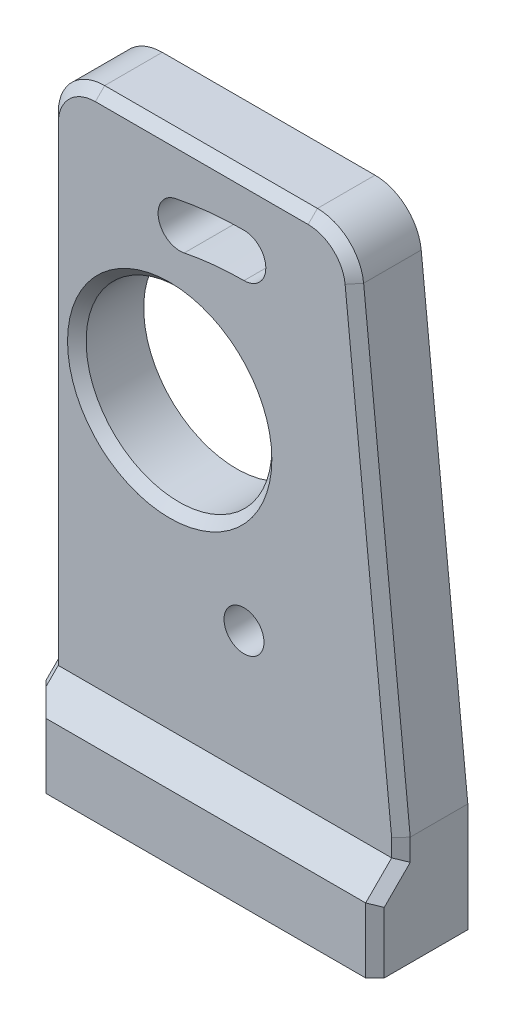
ISO-10303-21;
HEADER;
FILE_DESCRIPTION(('STEP AP214'),'2;1');
FILE_NAME('part.step','',(''),(''),'','','');
FILE_SCHEMA(('AUTOMOTIVE_DESIGN { 1 0 10303 214 1 1 1 1 }'));
ENDSEC;
DATA;
#1=APPLICATION_CONTEXT('core data for automotive mechanical design processes');
#2=APPLICATION_PROTOCOL_DEFINITION('international standard','automotive_design',2000,#1);
#3=PRODUCT_CONTEXT('',#1,'mechanical');
#4=PRODUCT('Part','Part','',(#3));
#5=PRODUCT_RELATED_PRODUCT_CATEGORY('part','',(#4));
#6=PRODUCT_DEFINITION_FORMATION('','',#4);
#7=PRODUCT_DEFINITION_CONTEXT('part definition',#1,'design');
#8=PRODUCT_DEFINITION('design','',#6,#7);
#9=PRODUCT_DEFINITION_SHAPE('','',#8);
#10=(LENGTH_UNIT() NAMED_UNIT(*) SI_UNIT(.MILLI.,.METRE.));
#11=(NAMED_UNIT(*) PLANE_ANGLE_UNIT() SI_UNIT($,.RADIAN.));
#12=(NAMED_UNIT(*) SI_UNIT($,.STERADIAN.) SOLID_ANGLE_UNIT());
#13=UNCERTAINTY_MEASURE_WITH_UNIT(LENGTH_MEASURE(1.E-05),#10,'distance_accuracy_value','');
#14=(GEOMETRIC_REPRESENTATION_CONTEXT(3) GLOBAL_UNCERTAINTY_ASSIGNED_CONTEXT((#13)) GLOBAL_UNIT_ASSIGNED_CONTEXT((#10,
#11,#12)) REPRESENTATION_CONTEXT('',''));
#15=CARTESIAN_POINT('',(0.,0.,0.));
#16=DIRECTION('',(0.,0.,1.));
#17=DIRECTION('',(1.,0.,0.));
#18=AXIS2_PLACEMENT_3D('',#15,#16,#17);
#19=CARTESIAN_POINT('',(7.91121884413889,23.0319457170168,0.));
#20=DIRECTION('',(0.,0.,1.));
#21=DIRECTION('',(1.,0.,0.));
#22=AXIS2_PLACEMENT_3D('',#19,#20,#21);
#23=CYLINDRICAL_SURFACE('',#22,2.15);
#24=CARTESIAN_POINT('',(7.91121884413889,23.0319457170168,4.00000000000001));
#25=DIRECTION('',(0.,0.,-1.));
#26=DIRECTION('',(-1.,0.,0.));
#27=AXIS2_PLACEMENT_3D('',#24,#25,#26);
#28=CIRCLE('',#27,2.15);
#29=CARTESIAN_POINT('',(5.76121884413889,23.0319457170168,4.00000000000001));
#30=VERTEX_POINT('',#29);
#31=EDGE_CURVE('E11',#30,#30,#28,.T.);
#32=ORIENTED_EDGE('',*,*,#31,.T.);
#33=EDGE_LOOP('',(#32));
#34=FACE_BOUND('',#33,.T.);
#35=CARTESIAN_POINT('',(7.91121884413889,23.0319457170168,7.2));
#36=DIRECTION('',(0.,0.,1.));
#37=DIRECTION('',(1.,0.,0.));
#38=AXIS2_PLACEMENT_3D('',#35,#36,#37);
#39=CIRCLE('',#38,2.15);
#40=CARTESIAN_POINT('',(10.0612188441389,23.0319457170168,7.2));
#41=VERTEX_POINT('',#40);
#42=EDGE_CURVE('E207',#41,#41,#39,.T.);
#43=ORIENTED_EDGE('',*,*,#42,.T.);
#44=EDGE_LOOP('',(#43));
#45=FACE_BOUND('',#44,.T.);
#46=ADVANCED_FACE('F37',(#34,#45),#23,.F.);
#47=CARTESIAN_POINT('',(-13.0887811558611,65.3706180274269,10.));
#48=DIRECTION('',(0.,-1.,0.));
#49=DIRECTION('',(0.,0.,-1.));
#50=AXIS2_PLACEMENT_3D('',#47,#48,#49);
#51=PLANE('',#50);
#52=DIRECTION('',(0.,0.,-1.));
#53=VECTOR('',#52,1.);
#54=CARTESIAN_POINT('',(-8.08878115586112,65.3706180274269,10.));
#55=LINE('',#54,#53);
#56=CARTESIAN_POINT('',(-8.08878115586112,65.3706180274269,0.));
#57=VERTEX_POINT('',#56);
#58=CARTESIAN_POINT('',(-8.08878115586112,65.3706180274269,6.2));
#59=VERTEX_POINT('',#58);
#60=EDGE_CURVE('E272',#57,#59,#55,.F.);
#61=ORIENTED_EDGE('',*,*,#60,.T.);
#62=DIRECTION('',(1.,0.,0.));
#63=VECTOR('',#62,1.);
#64=CARTESIAN_POINT('',(14.8206002828227,65.3706180274269,6.2));
#65=LINE('',#64,#63);
#66=CARTESIAN_POINT('',(14.8206002828227,65.3706180274269,6.2));
#67=VERTEX_POINT('',#66);
#68=EDGE_CURVE('E323',#59,#67,#65,.T.);
#69=ORIENTED_EDGE('',*,*,#68,.T.);
#70=DIRECTION('',(0.,0.,-1.));
#71=VECTOR('',#70,1.);
#72=CARTESIAN_POINT('',(14.8206002828227,65.3706180274269,10.));
#73=LINE('',#72,#71);
#74=CARTESIAN_POINT('',(14.8206002828227,65.3706180274269,0.));
#75=VERTEX_POINT('',#74);
#76=EDGE_CURVE('E270',#67,#75,#73,.T.);
#77=ORIENTED_EDGE('',*,*,#76,.T.);
#78=DIRECTION('',(-1.,0.,0.));
#79=VECTOR('',#78,1.);
#80=CARTESIAN_POINT('',(-13.0887811558611,65.3706180274269,0.));
#81=LINE('',#80,#79);
#82=EDGE_CURVE('E243',#75,#57,#81,.T.);
#83=ORIENTED_EDGE('',*,*,#82,.T.);
#84=EDGE_LOOP('',(#61,#69,#77,#83));
#85=FACE_BOUND('',#84,.T.);
#86=ADVANCED_FACE('F434',(#85),#51,.F.);
#87=CARTESIAN_POINT('',(-13.0887811558611,0.,10.));
#88=DIRECTION('',(1.,0.,0.));
#89=DIRECTION('',(0.,0.,-1.));
#90=AXIS2_PLACEMENT_3D('',#87,#88,#89);
#91=PLANE('',#90);
#92=DIRECTION('',(0.,0.,-1.));
#93=VECTOR('',#92,1.);
#94=CARTESIAN_POINT('',(-13.0887811558611,0.,10.));
#95=LINE('',#94,#93);
#96=CARTESIAN_POINT('',(-13.0887811558611,0.,7.49999999999998));
#97=VERTEX_POINT('',#96);
#98=CARTESIAN_POINT('',(-13.0887811558611,0.,0.));
#99=VERTEX_POINT('',#98);
#100=EDGE_CURVE('E248',#97,#99,#95,.T.);
#101=ORIENTED_EDGE('',*,*,#100,.F.);
#102=DIRECTION('',(0.,1.,0.));
#103=VECTOR('',#102,1.);
#104=CARTESIAN_POINT('',(-13.0887811558611,0.,7.49999999999998));
#105=LINE('',#104,#103);
#106=CARTESIAN_POINT('',(-13.0887811558611,8.08578643762685,7.49999999999998));
#107=VERTEX_POINT('',#106);
#108=EDGE_CURVE('E351',#97,#107,#105,.T.);
#109=ORIENTED_EDGE('',*,*,#108,.T.);
#110=DIRECTION('',(0.,0.707106781186544,-0.707106781186551));
#111=VECTOR('',#110,1.);
#112=CARTESIAN_POINT('',(-13.0887811558611,9.09289321881338,6.49289321881345));
#113=LINE('',#112,#111);
#114=CARTESIAN_POINT('',(-13.0887811558611,9.38578643762682,6.2));
#115=VERTEX_POINT('',#114);
#116=EDGE_CURVE('E315',#107,#115,#113,.T.);
#117=ORIENTED_EDGE('',*,*,#116,.T.);
#118=DIRECTION('',(0.,1.,0.));
#119=VECTOR('',#118,1.);
#120=CARTESIAN_POINT('',(-13.0887811558611,60.3706180274269,6.2));
#121=LINE('',#120,#119);
#122=CARTESIAN_POINT('',(-13.0887811558611,60.3706180274269,6.2));
#123=VERTEX_POINT('',#122);
#124=EDGE_CURVE('E313',#115,#123,#121,.T.);
#125=ORIENTED_EDGE('',*,*,#124,.T.);
#126=DIRECTION('',(0.,0.,-1.));
#127=VECTOR('',#126,1.);
#128=CARTESIAN_POINT('',(-13.0887811558611,60.3706180274269,10.));
#129=LINE('',#128,#127);
#130=CARTESIAN_POINT('',(-13.0887811558611,60.3706180274269,0.));
#131=VERTEX_POINT('',#130);
#132=EDGE_CURVE('E264',#123,#131,#129,.T.);
#133=ORIENTED_EDGE('',*,*,#132,.T.);
#134=DIRECTION('',(0.,-1.,0.));
#135=VECTOR('',#134,1.);
#136=CARTESIAN_POINT('',(-13.0887811558611,0.,0.));
#137=LINE('',#136,#135);
#138=EDGE_CURVE('E252',#131,#99,#137,.T.);
#139=ORIENTED_EDGE('',*,*,#138,.T.);
#140=EDGE_LOOP('',(#101,#109,#117,#125,#133,#139));
#141=FACE_BOUND('',#140,.T.);
#142=ADVANCED_FACE('F373',(#141),#91,.F.);
#143=CARTESIAN_POINT('',(28.2870012815656,0.,10.));
#144=DIRECTION('',(0.,1.,0.));
#145=DIRECTION('',(-1.,0.,0.));
#146=AXIS2_PLACEMENT_3D('',#143,#144,#145);
#147=PLANE('',#146);
#148=CARTESIAN_POINT('',(6.18,0.,5.));
#149=DIRECTION('',(0.,-1.,0.));
#150=DIRECTION('',(1.,0.,0.));
#151=AXIS2_PLACEMENT_3D('',#148,#149,#150);
#152=CIRCLE('',#151,1.5);
#153=CARTESIAN_POINT('',(7.68,0.,5.));
#154=VERTEX_POINT('',#153);
#155=EDGE_CURVE('E232',#154,#154,#152,.T.);
#156=ORIENTED_EDGE('',*,*,#155,.F.);
#157=EDGE_LOOP('',(#156));
#158=FACE_BOUND('',#157,.T.);
#159=CARTESIAN_POINT('',(19.36,0.,5.));
#160=DIRECTION('',(0.,-1.,0.));
#161=DIRECTION('',(1.,0.,0.));
#162=AXIS2_PLACEMENT_3D('',#159,#160,#161);
#163=CIRCLE('',#162,1.5);
#164=CARTESIAN_POINT('',(20.86,0.,5.));
#165=VERTEX_POINT('',#164);
#166=EDGE_CURVE('E227',#165,#165,#163,.T.);
#167=ORIENTED_EDGE('',*,*,#166,.F.);
#168=EDGE_LOOP('',(#167));
#169=FACE_BOUND('',#168,.T.);
#170=CARTESIAN_POINT('',(-7.,0.,5.));
#171=DIRECTION('',(0.,-1.,0.));
#172=DIRECTION('',(1.,0.,0.));
#173=AXIS2_PLACEMENT_3D('',#170,#171,#172);
#174=CIRCLE('',#173,1.5);
#175=CARTESIAN_POINT('',(-5.5,0.,5.));
#176=VERTEX_POINT('',#175);
#177=EDGE_CURVE('E231',#176,#176,#174,.T.);
#178=ORIENTED_EDGE('',*,*,#177,.F.);
#179=EDGE_LOOP('',(#178));
#180=FACE_BOUND('',#179,.T.);
#181=DIRECTION('',(1.,0.,0.));
#182=VECTOR('',#181,1.);
#183=CARTESIAN_POINT('',(28.2870012815656,0.,10.));
#184=LINE('',#183,#182);
#185=CARTESIAN_POINT('',(-10.5887811558611,0.,10.));
#186=VERTEX_POINT('',#185);
#187=CARTESIAN_POINT('',(23.8127338897394,0.,10.));
#188=VERTEX_POINT('',#187);
#189=EDGE_CURVE('E246',#186,#188,#184,.T.);
#190=ORIENTED_EDGE('',*,*,#189,.F.);
#191=DIRECTION('',(0.707106781186546,0.,0.707106781186549));
#192=VECTOR('',#191,1.);
#193=CARTESIAN_POINT('',(-10.5887811558611,0.,10.));
#194=LINE('',#193,#192);
#195=EDGE_CURVE('E349',#186,#97,#194,.F.);
#196=ORIENTED_EDGE('',*,*,#195,.T.);
#197=ORIENTED_EDGE('',*,*,#100,.T.);
#198=DIRECTION('',(1.,0.,0.));
#199=VECTOR('',#198,1.);
#200=CARTESIAN_POINT('',(28.2870012815656,0.,0.));
#201=LINE('',#200,#199);
#202=CARTESIAN_POINT('',(24.8127338897394,0.,0.));
#203=VERTEX_POINT('',#202);
#204=EDGE_CURVE('E249',#99,#203,#201,.T.);
#205=ORIENTED_EDGE('',*,*,#204,.T.);
#206=DIRECTION('',(0.,0.,-1.));
#207=VECTOR('',#206,1.);
#208=CARTESIAN_POINT('',(24.8127338897394,0.,10.));
#209=LINE('',#208,#207);
#210=CARTESIAN_POINT('',(24.8127338897394,0.,9.));
#211=VERTEX_POINT('',#210);
#212=EDGE_CURVE('E220',#211,#203,#209,.T.);
#213=ORIENTED_EDGE('',*,*,#212,.F.);
#214=DIRECTION('',(0.707106781186548,0.,-0.707106781186548));
#215=VECTOR('',#214,1.);
#216=CARTESIAN_POINT('',(23.8127338897394,0.,10.));
#217=LINE('',#216,#215);
#218=EDGE_CURVE('E305',#211,#188,#217,.F.);
#219=ORIENTED_EDGE('',*,*,#218,.T.);
#220=EDGE_LOOP('',(#190,#196,#197,#205,#213,#219));
#221=FACE_BOUND('',#220,.T.);
#222=ADVANCED_FACE('F371',(#158,#169,#180,#221),#147,.F.);
#223=CARTESIAN_POINT('',(0.,0.,10.));
#224=DIRECTION('',(0.,0.,-1.));
#225=DIRECTION('',(-1.,0.,0.));
#226=AXIS2_PLACEMENT_3D('',#223,#224,#225);
#227=PLANE('',#226);
#228=DIRECTION('',(-1.,0.,0.));
#229=VECTOR('',#228,1.);
#230=CARTESIAN_POINT('',(0.,6.99999999999997,10.));
#231=LINE('',#230,#229);
#232=CARTESIAN_POINT('',(23.8127338897394,6.99999999999997,10.));
#233=VERTEX_POINT('',#232);
#234=CARTESIAN_POINT('',(-10.5887811558611,6.99999999999997,10.));
#235=VERTEX_POINT('',#234);
#236=EDGE_CURVE('E258',#233,#235,#231,.T.);
#237=ORIENTED_EDGE('',*,*,#236,.T.);
#238=DIRECTION('',(0.,-1.,0.));
#239=VECTOR('',#238,1.);
#240=CARTESIAN_POINT('',(-10.5887811558611,0.,10.));
#241=LINE('',#240,#239);
#242=EDGE_CURVE('E325',#235,#186,#241,.T.);
#243=ORIENTED_EDGE('',*,*,#242,.T.);
#244=ORIENTED_EDGE('',*,*,#189,.T.);
#245=DIRECTION('',(0.,1.,0.));
#246=VECTOR('',#245,1.);
#247=CARTESIAN_POINT('',(23.8127338897394,0.,10.));
#248=LINE('',#247,#246);
#249=EDGE_CURVE('E296',#188,#233,#248,.T.);
#250=ORIENTED_EDGE('',*,*,#249,.T.);
#251=EDGE_LOOP('',(#237,#243,#244,#250));
#252=FACE_BOUND('',#251,.T.);
#253=ADVANCED_FACE('F364',(#252),#227,.F.);
#254=CARTESIAN_POINT('',(0.,0.,0.));
#255=DIRECTION('',(0.,0.,-1.));
#256=DIRECTION('',(-1.,0.,0.));
#257=AXIS2_PLACEMENT_3D('',#254,#255,#256);
#258=PLANE('',#257);
#259=CARTESIAN_POINT('',(7.91121884413889,58.0319457170168,0.));
#260=DIRECTION('',(0.,0.,-1.));
#261=DIRECTION('',(-1.,0.,0.));
#262=AXIS2_PLACEMENT_3D('',#259,#260,#261);
#263=CIRCLE('',#262,2.35);
#264=CARTESIAN_POINT('',(7.91121884413889,60.3819457170168,0.));
#265=VERTEX_POINT('',#264);
#266=CARTESIAN_POINT('',(7.91121884413889,55.6819457170168,0.));
#267=VERTEX_POINT('',#266);
#268=EDGE_CURVE('E201',#265,#267,#263,.T.);
#269=ORIENTED_EDGE('',*,*,#268,.F.);
#270=CARTESIAN_POINT('',(7.91121884413889,23.0319457170168,0.));
#271=DIRECTION('',(0.,0.,-1.));
#272=DIRECTION('',(-1.,0.,0.));
#273=AXIS2_PLACEMENT_3D('',#270,#271,#272);
#274=CIRCLE('',#273,37.35);
#275=CARTESIAN_POINT('',(0.546614537047571,59.6486782774183,0.));
#276=VERTEX_POINT('',#275);
#277=EDGE_CURVE('E194',#276,#265,#274,.T.);
#278=ORIENTED_EDGE('',*,*,#277,.F.);
#279=CARTESIAN_POINT('',(1.00998321500379,57.3448142475136,0.));
#280=DIRECTION('',(0.,0.,-1.));
#281=DIRECTION('',(-1.,0.,0.));
#282=AXIS2_PLACEMENT_3D('',#279,#280,#281);
#283=CIRCLE('',#282,2.35);
#284=CARTESIAN_POINT('',(1.47335189296,55.0409502176088,0.));
#285=VERTEX_POINT('',#284);
#286=EDGE_CURVE('E174',#285,#276,#283,.T.);
#287=ORIENTED_EDGE('',*,*,#286,.F.);
#288=CARTESIAN_POINT('',(7.91121884413889,23.0319457170168,0.));
#289=DIRECTION('',(0.,0.,-1.));
#290=DIRECTION('',(-1.,0.,0.));
#291=AXIS2_PLACEMENT_3D('',#288,#289,#290);
#292=CIRCLE('',#291,32.65);
#293=EDGE_CURVE('E199',#267,#285,#292,.F.);
#294=ORIENTED_EDGE('',*,*,#293,.F.);
#295=EDGE_LOOP('',(#269,#278,#287,#294));
#296=FACE_BOUND('',#295,.T.);
#297=CARTESIAN_POINT('',(7.91121884413889,23.0319457170168,0.));
#298=DIRECTION('',(0.,0.,-1.));
#299=DIRECTION('',(-1.,0.,0.));
#300=AXIS2_PLACEMENT_3D('',#297,#298,#299);
#301=CIRCLE('',#300,3.65);
#302=CARTESIAN_POINT('',(4.26121884413889,23.0319457170168,0.));
#303=VERTEX_POINT('',#302);
#304=EDGE_CURVE('E203',#303,#303,#301,.T.);
#305=ORIENTED_EDGE('',*,*,#304,.F.);
#306=EDGE_LOOP('',(#305));
#307=FACE_BOUND('',#306,.T.);
#308=ORIENTED_EDGE('',*,*,#138,.F.);
#309=CARTESIAN_POINT('',(-8.08878115586112,60.3706180274269,0.));
#310=DIRECTION('',(0.,0.,-1.));
#311=DIRECTION('',(-1.,0.,0.));
#312=AXIS2_PLACEMENT_3D('',#309,#310,#311);
#313=CIRCLE('',#312,5.);
#314=EDGE_CURVE('E268',#131,#57,#313,.T.);
#315=ORIENTED_EDGE('',*,*,#314,.T.);
#316=ORIENTED_EDGE('',*,*,#82,.F.);
#317=CARTESIAN_POINT('',(14.8206002828227,60.3706180274269,0.));
#318=DIRECTION('',(0.,0.,-1.));
#319=DIRECTION('',(-1.,0.,0.));
#320=AXIS2_PLACEMENT_3D('',#317,#318,#319);
#321=CIRCLE('',#320,5.);
#322=CARTESIAN_POINT('',(19.7947348632663,60.8785404384662,0.));
#323=VERTEX_POINT('',#322);
#324=EDGE_CURVE('E266',#75,#323,#321,.T.);
#325=ORIENTED_EDGE('',*,*,#324,.T.);
#326=DIRECTION('',(-0.101584482207855,0.994826916088704,0.));
#327=VECTOR('',#326,1.);
#328=CARTESIAN_POINT('',(24.8127338897394,11.7367779571846,0.));
#329=LINE('',#328,#327);
#330=CARTESIAN_POINT('',(24.8127338897394,11.7367779571846,0.));
#331=VERTEX_POINT('',#330);
#332=EDGE_CURVE('E216',#331,#323,#329,.T.);
#333=ORIENTED_EDGE('',*,*,#332,.F.);
#334=DIRECTION('',(0.,1.,0.));
#335=VECTOR('',#334,1.);
#336=CARTESIAN_POINT('',(24.8127338897394,11.7367779571846,0.));
#337=LINE('',#336,#335);
#338=EDGE_CURVE('E213',#203,#331,#337,.T.);
#339=ORIENTED_EDGE('',*,*,#338,.F.);
#340=ORIENTED_EDGE('',*,*,#204,.F.);
#341=EDGE_LOOP('',(#308,#315,#316,#325,#333,#339,#340));
#342=FACE_BOUND('',#341,.T.);
#343=CARTESIAN_POINT('',(-0.0887811558611135,40.5319457170168,0.));
#344=DIRECTION('',(0.,0.,1.));
#345=DIRECTION('',(1.,0.,0.));
#346=AXIS2_PLACEMENT_3D('',#343,#344,#345);
#347=CIRCLE('',#346,10.);
#348=CARTESIAN_POINT('',(9.91121884413889,40.5319457170168,0.));
#349=VERTEX_POINT('',#348);
#350=EDGE_CURVE('E223',#349,#349,#347,.T.);
#351=ORIENTED_EDGE('',*,*,#350,.T.);
#352=EDGE_LOOP('',(#351));
#353=FACE_BOUND('',#352,.T.);
#354=ADVANCED_FACE('F381',(#296,#307,#342,#353),#258,.T.);
#355=CARTESIAN_POINT('',(-7.,8.,5.));
#356=DIRECTION('',(0.,-1.,0.));
#357=DIRECTION('',(1.,0.,0.));
#358=AXIS2_PLACEMENT_3D('',#355,#356,#357);
#359=CYLINDRICAL_SURFACE('',#358,1.5);
#360=CARTESIAN_POINT('',(-7.,8.,5.));
#361=DIRECTION('',(0.,-1.,0.));
#362=DIRECTION('',(1.,0.,0.));
#363=AXIS2_PLACEMENT_3D('',#360,#361,#362);
#364=CIRCLE('',#363,1.5);
#365=CARTESIAN_POINT('',(-5.5,8.,5.));
#366=VERTEX_POINT('',#365);
#367=EDGE_CURVE('E240',#366,#366,#364,.T.);
#368=ORIENTED_EDGE('',*,*,#367,.F.);
#369=EDGE_LOOP('',(#368));
#370=FACE_BOUND('',#369,.T.);
#371=ORIENTED_EDGE('',*,*,#177,.T.);
#372=EDGE_LOOP('',(#371));
#373=FACE_BOUND('',#372,.T.);
#374=ADVANCED_FACE('F484',(#370,#373),#359,.F.);
#375=CARTESIAN_POINT('',(-7.,8.,5.));
#376=DIRECTION('',(0.,-1.,0.));
#377=DIRECTION('',(1.,0.,0.));
#378=AXIS2_PLACEMENT_3D('',#375,#376,#377);
#379=PLANE('',#378);
#380=ORIENTED_EDGE('',*,*,#367,.T.);
#381=EDGE_LOOP('',(#380));
#382=FACE_BOUND('',#381,.T.);
#383=ADVANCED_FACE('F492',(#382),#379,.T.);
#384=CARTESIAN_POINT('',(19.36,8.,5.));
#385=DIRECTION('',(0.,-1.,0.));
#386=DIRECTION('',(1.,0.,0.));
#387=AXIS2_PLACEMENT_3D('',#384,#385,#386);
#388=CYLINDRICAL_SURFACE('',#387,1.5);
#389=CARTESIAN_POINT('',(19.36,8.,5.));
#390=DIRECTION('',(0.,-1.,0.));
#391=DIRECTION('',(1.,0.,0.));
#392=AXIS2_PLACEMENT_3D('',#389,#390,#391);
#393=CIRCLE('',#392,1.5);
#394=CARTESIAN_POINT('',(20.86,8.,5.));
#395=VERTEX_POINT('',#394);
#396=EDGE_CURVE('E235',#395,#395,#393,.T.);
#397=ORIENTED_EDGE('',*,*,#396,.F.);
#398=EDGE_LOOP('',(#397));
#399=FACE_BOUND('',#398,.T.);
#400=ORIENTED_EDGE('',*,*,#166,.T.);
#401=EDGE_LOOP('',(#400));
#402=FACE_BOUND('',#401,.T.);
#403=ADVANCED_FACE('F601',(#399,#402),#388,.F.);
#404=CARTESIAN_POINT('',(19.36,8.,5.));
#405=DIRECTION('',(0.,-1.,0.));
#406=DIRECTION('',(1.,0.,0.));
#407=AXIS2_PLACEMENT_3D('',#404,#405,#406);
#408=PLANE('',#407);
#409=ORIENTED_EDGE('',*,*,#396,.T.);
#410=EDGE_LOOP('',(#409));
#411=FACE_BOUND('',#410,.T.);
#412=ADVANCED_FACE('F610',(#411),#408,.T.);
#413=CARTESIAN_POINT('',(6.18,8.,5.));
#414=DIRECTION('',(0.,-1.,0.));
#415=DIRECTION('',(1.,0.,0.));
#416=AXIS2_PLACEMENT_3D('',#413,#414,#415);
#417=CYLINDRICAL_SURFACE('',#416,1.5);
#418=CARTESIAN_POINT('',(6.18,8.,5.));
#419=DIRECTION('',(0.,-1.,0.));
#420=DIRECTION('',(1.,0.,0.));
#421=AXIS2_PLACEMENT_3D('',#418,#419,#420);
#422=CIRCLE('',#421,1.5);
#423=CARTESIAN_POINT('',(7.68,8.,5.));
#424=VERTEX_POINT('',#423);
#425=EDGE_CURVE('E228',#424,#424,#422,.T.);
#426=ORIENTED_EDGE('',*,*,#425,.F.);
#427=EDGE_LOOP('',(#426));
#428=FACE_BOUND('',#427,.T.);
#429=ORIENTED_EDGE('',*,*,#155,.T.);
#430=EDGE_LOOP('',(#429));
#431=FACE_BOUND('',#430,.T.);
#432=ADVANCED_FACE('F619',(#428,#431),#417,.F.);
#433=CARTESIAN_POINT('',(6.18,8.,5.));
#434=DIRECTION('',(0.,-1.,0.));
#435=DIRECTION('',(1.,0.,0.));
#436=AXIS2_PLACEMENT_3D('',#433,#434,#435);
#437=PLANE('',#436);
#438=ORIENTED_EDGE('',*,*,#425,.T.);
#439=EDGE_LOOP('',(#438));
#440=FACE_BOUND('',#439,.T.);
#441=ADVANCED_FACE('F572',(#440),#437,.T.);
#442=CARTESIAN_POINT('',(0.,0.,7.2));
#443=DIRECTION('',(0.,0.,1.));
#444=DIRECTION('',(1.,0.,0.));
#445=AXIS2_PLACEMENT_3D('',#442,#443,#444);
#446=PLANE('',#445);
#447=CARTESIAN_POINT('',(7.91121884413889,58.0319457170168,7.2));
#448=DIRECTION('',(0.,0.,1.));
#449=DIRECTION('',(1.,0.,0.));
#450=AXIS2_PLACEMENT_3D('',#447,#448,#449);
#451=CIRCLE('',#450,2.35);
#452=CARTESIAN_POINT('',(7.91121884413889,55.6819457170168,7.2));
#453=VERTEX_POINT('',#452);
#454=CARTESIAN_POINT('',(7.91121884413889,60.3819457170168,7.2));
#455=VERTEX_POINT('',#454);
#456=EDGE_CURVE('E60',#453,#455,#451,.T.);
#457=ORIENTED_EDGE('',*,*,#456,.F.);
#458=CARTESIAN_POINT('',(7.91121884413889,23.0319457170168,7.2));
#459=DIRECTION('',(0.,0.,-1.));
#460=DIRECTION('',(1.,0.,0.));
#461=AXIS2_PLACEMENT_3D('',#458,#459,#460);
#462=CIRCLE('',#461,32.65);
#463=CARTESIAN_POINT('',(1.47335189296,55.0409502176088,7.2));
#464=VERTEX_POINT('',#463);
#465=EDGE_CURVE('E187',#464,#453,#462,.T.);
#466=ORIENTED_EDGE('',*,*,#465,.F.);
#467=CARTESIAN_POINT('',(1.00998321500379,57.3448142475136,7.2));
#468=DIRECTION('',(0.,0.,1.));
#469=DIRECTION('',(1.,0.,0.));
#470=AXIS2_PLACEMENT_3D('',#467,#468,#469);
#471=CIRCLE('',#470,2.35);
#472=CARTESIAN_POINT('',(0.546614537047571,59.6486782774183,7.2));
#473=VERTEX_POINT('',#472);
#474=EDGE_CURVE('E171',#473,#464,#471,.T.);
#475=ORIENTED_EDGE('',*,*,#474,.F.);
#476=CARTESIAN_POINT('',(7.91121884413889,23.0319457170168,7.2));
#477=DIRECTION('',(0.,0.,1.));
#478=DIRECTION('',(1.,0.,0.));
#479=AXIS2_PLACEMENT_3D('',#476,#477,#478);
#480=CIRCLE('',#479,37.35);
#481=EDGE_CURVE('E180',#455,#473,#480,.T.);
#482=ORIENTED_EDGE('',*,*,#481,.F.);
#483=EDGE_LOOP('',(#457,#466,#475,#482));
#484=FACE_BOUND('',#483,.T.);
#485=ORIENTED_EDGE('',*,*,#42,.F.);
#486=EDGE_LOOP('',(#485));
#487=FACE_BOUND('',#486,.T.);
#488=CARTESIAN_POINT('',(-0.0887811558611135,40.5319457170168,7.2));
#489=DIRECTION('',(0.,0.,1.));
#490=DIRECTION('',(1.,0.,0.));
#491=AXIS2_PLACEMENT_3D('',#488,#489,#490);
#492=CIRCLE('',#491,11.);
#493=CARTESIAN_POINT('',(10.9112188441389,40.5319457170168,7.2));
#494=VERTEX_POINT('',#493);
#495=EDGE_CURVE('E293',#494,#494,#492,.F.);
#496=ORIENTED_EDGE('',*,*,#495,.T.);
#497=EDGE_LOOP('',(#496));
#498=FACE_BOUND('',#497,.T.);
#499=DIRECTION('',(-1.,0.,0.));
#500=VECTOR('',#499,1.);
#501=CARTESIAN_POINT('',(0.,9.79999999999994,7.2));
#502=LINE('',#501,#500);
#503=CARTESIAN_POINT('',(-12.0887811558611,9.79999999999994,7.2));
#504=VERTEX_POINT('',#503);
#505=CARTESIAN_POINT('',(23.8127338897394,9.79999999999994,7.2));
#506=VERTEX_POINT('',#505);
#507=EDGE_CURVE('E261',#504,#506,#502,.F.);
#508=ORIENTED_EDGE('',*,*,#507,.T.);
#509=DIRECTION('',(0.,1.,0.));
#510=VECTOR('',#509,1.);
#511=CARTESIAN_POINT('',(23.8127338897394,11.7367779571846,7.2));
#512=LINE('',#511,#510);
#513=CARTESIAN_POINT('',(23.8127338897394,11.6858539991266,7.2));
#514=VERTEX_POINT('',#513);
#515=EDGE_CURVE('E291',#506,#514,#512,.T.);
#516=ORIENTED_EDGE('',*,*,#515,.T.);
#517=DIRECTION('',(-0.101584482207855,0.994826916088705,0.));
#518=VECTOR('',#517,1.);
#519=CARTESIAN_POINT('',(18.7999079471775,60.7769559562584,7.2));
#520=LINE('',#519,#518);
#521=CARTESIAN_POINT('',(18.7999079471775,60.7769559562583,7.2));
#522=VERTEX_POINT('',#521);
#523=EDGE_CURVE('E289',#514,#522,#520,.T.);
#524=ORIENTED_EDGE('',*,*,#523,.T.);
#525=CARTESIAN_POINT('',(14.8206002828227,60.3706180274269,7.2));
#526=DIRECTION('',(0.,0.,1.));
#527=DIRECTION('',(1.,0.,0.));
#528=AXIS2_PLACEMENT_3D('',#525,#526,#527);
#529=CIRCLE('',#528,4.);
#530=CARTESIAN_POINT('',(14.8206002828227,64.3706180274269,7.2));
#531=VERTEX_POINT('',#530);
#532=EDGE_CURVE('E285',#522,#531,#529,.T.);
#533=ORIENTED_EDGE('',*,*,#532,.T.);
#534=DIRECTION('',(-1.,0.,0.));
#535=VECTOR('',#534,1.);
#536=CARTESIAN_POINT('',(-8.08878115586112,64.3706180274269,7.2));
#537=LINE('',#536,#535);
#538=CARTESIAN_POINT('',(-8.08878115586112,64.3706180274269,7.2));
#539=VERTEX_POINT('',#538);
#540=EDGE_CURVE('E281',#531,#539,#537,.T.);
#541=ORIENTED_EDGE('',*,*,#540,.T.);
#542=CARTESIAN_POINT('',(-8.08878115586112,60.3706180274269,7.2));
#543=DIRECTION('',(0.,0.,1.));
#544=DIRECTION('',(1.,0.,0.));
#545=AXIS2_PLACEMENT_3D('',#542,#543,#544);
#546=CIRCLE('',#545,4.);
#547=CARTESIAN_POINT('',(-12.0887811558611,60.3706180274269,7.2));
#548=VERTEX_POINT('',#547);
#549=EDGE_CURVE('E283',#539,#548,#546,.T.);
#550=ORIENTED_EDGE('',*,*,#549,.T.);
#551=DIRECTION('',(0.,-1.,0.));
#552=VECTOR('',#551,1.);
#553=CARTESIAN_POINT('',(-12.0887811558611,9.79999999999994,7.2));
#554=LINE('',#553,#552);
#555=EDGE_CURVE('E287',#548,#504,#554,.T.);
#556=ORIENTED_EDGE('',*,*,#555,.T.);
#557=EDGE_LOOP('',(#508,#516,#524,#533,#541,#550,#556));
#558=FACE_BOUND('',#557,.T.);
#559=ADVANCED_FACE('F184',(#484,#487,#498,#558),#446,.T.);
#560=CARTESIAN_POINT('',(-0.0887811558611135,40.5319457170168,0.));
#561=DIRECTION('',(0.,0.,1.));
#562=DIRECTION('',(1.,0.,0.));
#563=AXIS2_PLACEMENT_3D('',#560,#561,#562);
#564=CYLINDRICAL_SURFACE('',#563,10.);
#565=CARTESIAN_POINT('',(-0.0887811558611135,40.5319457170168,6.19999999999998));
#566=DIRECTION('',(0.,0.,1.));
#567=DIRECTION('',(1.,0.,0.));
#568=AXIS2_PLACEMENT_3D('',#565,#566,#567);
#569=CIRCLE('',#568,10.);
#570=CARTESIAN_POINT('',(9.91121884413889,40.5319457170168,6.19999999999998));
#571=VERTEX_POINT('',#570);
#572=EDGE_CURVE('E278',#571,#571,#569,.T.);
#573=ORIENTED_EDGE('',*,*,#572,.T.);
#574=EDGE_LOOP('',(#573));
#575=FACE_BOUND('',#574,.T.);
#576=ORIENTED_EDGE('',*,*,#350,.F.);
#577=EDGE_LOOP('',(#576));
#578=FACE_BOUND('',#577,.T.);
#579=ADVANCED_FACE('F503',(#575,#578),#564,.F.);
#580=CARTESIAN_POINT('',(0.,6.99999999999997,10.));
#581=DIRECTION('',(0.,-0.707106781186551,-0.707106781186544));
#582=DIRECTION('',(-1.,0.,0.));
#583=AXIS2_PLACEMENT_3D('',#580,#581,#582);
#584=PLANE('',#583);
#585=DIRECTION('',(0.,0.707106781186544,-0.707106781186551));
#586=VECTOR('',#585,1.);
#587=CARTESIAN_POINT('',(-12.0887811558611,6.99999999999997,10.));
#588=LINE('',#587,#586);
#589=CARTESIAN_POINT('',(-12.0887811558611,8.49999999999995,8.50000000000001));
#590=VERTEX_POINT('',#589);
#591=EDGE_CURVE('E308',#504,#590,#588,.F.);
#592=ORIENTED_EDGE('',*,*,#591,.T.);
#593=DIRECTION('',(0.577350269189626,-0.577350269189623,0.577350269189629));
#594=VECTOR('',#593,1.);
#595=CARTESIAN_POINT('',(-7.05918743724075,3.47040628137962,13.5295937186204));
#596=LINE('',#595,#594);
#597=EDGE_CURVE('E45',#590,#235,#596,.T.);
#598=ORIENTED_EDGE('',*,*,#597,.T.);
#599=ORIENTED_EDGE('',*,*,#236,.F.);
#600=DIRECTION('',(0.,-0.707106781186544,0.707106781186551));
#601=VECTOR('',#600,1.);
#602=CARTESIAN_POINT('',(23.8127338897394,9.79999999999994,7.2));
#603=LINE('',#602,#601);
#604=EDGE_CURVE('E311',#233,#506,#603,.F.);
#605=ORIENTED_EDGE('',*,*,#604,.T.);
#606=ORIENTED_EDGE('',*,*,#507,.F.);
#607=EDGE_LOOP('',(#592,#598,#599,#605,#606));
#608=FACE_BOUND('',#607,.T.);
#609=ADVANCED_FACE('F357',(#608),#584,.F.);
#610=CARTESIAN_POINT('',(24.8127338897394,11.7367779571846,10.));
#611=DIRECTION('',(-0.994826916088704,-0.101584482207855,0.));
#612=DIRECTION('',(0.101584482207855,-0.994826916088704,0.));
#613=AXIS2_PLACEMENT_3D('',#610,#611,#612);
#614=PLANE('',#613);
#615=DIRECTION('',(0.,0.,-1.));
#616=VECTOR('',#615,1.);
#617=CARTESIAN_POINT('',(19.7947348632663,60.8785404384662,10.));
#618=LINE('',#617,#616);
#619=CARTESIAN_POINT('',(19.7947348632663,60.8785404384662,6.2));
#620=VERTEX_POINT('',#619);
#621=EDGE_CURVE('E275',#323,#620,#618,.F.);
#622=ORIENTED_EDGE('',*,*,#621,.T.);
#623=DIRECTION('',(0.101584482207855,-0.994826916088704,0.));
#624=VECTOR('',#623,1.);
#625=CARTESIAN_POINT('',(24.8127338897394,11.7367779571846,6.2));
#626=LINE('',#625,#624);
#627=CARTESIAN_POINT('',(24.8127338897394,11.7367779571846,6.2));
#628=VERTEX_POINT('',#627);
#629=EDGE_CURVE('E317',#620,#628,#626,.T.);
#630=ORIENTED_EDGE('',*,*,#629,.T.);
#631=DIRECTION('',(0.,0.,-1.));
#632=VECTOR('',#631,1.);
#633=CARTESIAN_POINT('',(24.8127338897394,11.7367779571846,10.));
#634=LINE('',#633,#632);
#635=EDGE_CURVE('E221',#628,#331,#634,.T.);
#636=ORIENTED_EDGE('',*,*,#635,.T.);
#637=ORIENTED_EDGE('',*,*,#332,.T.);
#638=EDGE_LOOP('',(#622,#630,#636,#637));
#639=FACE_BOUND('',#638,.T.);
#640=ADVANCED_FACE('F441',(#639),#614,.F.);
#641=CARTESIAN_POINT('',(24.8127338897394,11.7367779571846,10.));
#642=DIRECTION('',(-1.,0.,0.));
#643=DIRECTION('',(0.,-1.,0.));
#644=AXIS2_PLACEMENT_3D('',#641,#642,#643);
#645=PLANE('',#644);
#646=DIRECTION('',(0.,-0.707106781186544,0.707106781186551));
#647=VECTOR('',#646,1.);
#648=CARTESIAN_POINT('',(24.8127338897394,6.29289321881342,9.29289321881345));
#649=LINE('',#648,#647);
#650=CARTESIAN_POINT('',(24.8127338897394,9.38578643762684,6.2));
#651=VERTEX_POINT('',#650);
#652=CARTESIAN_POINT('',(24.8127338897394,6.58578643762687,9.));
#653=VERTEX_POINT('',#652);
#654=EDGE_CURVE('E301',#651,#653,#649,.T.);
#655=ORIENTED_EDGE('',*,*,#654,.T.);
#656=DIRECTION('',(0.,-1.,0.));
#657=VECTOR('',#656,1.);
#658=CARTESIAN_POINT('',(24.8127338897394,11.7367779571846,9.));
#659=LINE('',#658,#657);
#660=EDGE_CURVE('E303',#653,#211,#659,.T.);
#661=ORIENTED_EDGE('',*,*,#660,.T.);
#662=ORIENTED_EDGE('',*,*,#212,.T.);
#663=ORIENTED_EDGE('',*,*,#338,.T.);
#664=ORIENTED_EDGE('',*,*,#635,.F.);
#665=DIRECTION('',(0.,-1.,0.));
#666=VECTOR('',#665,1.);
#667=CARTESIAN_POINT('',(24.8127338897394,9.79999999999994,6.2));
#668=LINE('',#667,#666);
#669=EDGE_CURVE('E299',#628,#651,#668,.T.);
#670=ORIENTED_EDGE('',*,*,#669,.T.);
#671=EDGE_LOOP('',(#655,#661,#662,#663,#664,#670));
#672=FACE_BOUND('',#671,.T.);
#673=ADVANCED_FACE('F443',(#672),#645,.F.);
#674=CARTESIAN_POINT('',(-8.08878115586112,60.3706180274269,10.));
#675=DIRECTION('',(0.,0.,-1.));
#676=DIRECTION('',(-1.,0.,0.));
#677=AXIS2_PLACEMENT_3D('',#674,#675,#676);
#678=CYLINDRICAL_SURFACE('',#677,5.);
#679=ORIENTED_EDGE('',*,*,#132,.F.);
#680=CARTESIAN_POINT('',(-8.08878115586112,60.3706180274269,6.2));
#681=DIRECTION('',(0.,0.,1.));
#682=DIRECTION('',(1.,0.,0.));
#683=AXIS2_PLACEMENT_3D('',#680,#681,#682);
#684=CIRCLE('',#683,5.);
#685=EDGE_CURVE('E321',#123,#59,#684,.F.);
#686=ORIENTED_EDGE('',*,*,#685,.T.);
#687=ORIENTED_EDGE('',*,*,#60,.F.);
#688=ORIENTED_EDGE('',*,*,#314,.F.);
#689=EDGE_LOOP('',(#679,#686,#687,#688));
#690=FACE_BOUND('',#689,.T.);
#691=ADVANCED_FACE('F430',(#690),#678,.T.);
#692=CARTESIAN_POINT('',(14.8206002828227,60.3706180274269,10.));
#693=DIRECTION('',(0.,0.,-1.));
#694=DIRECTION('',(-1.,0.,0.));
#695=AXIS2_PLACEMENT_3D('',#692,#693,#694);
#696=CYLINDRICAL_SURFACE('',#695,5.);
#697=ORIENTED_EDGE('',*,*,#76,.F.);
#698=CARTESIAN_POINT('',(14.8206002828227,60.3706180274269,6.2));
#699=DIRECTION('',(0.,0.,1.));
#700=DIRECTION('',(1.,0.,0.));
#701=AXIS2_PLACEMENT_3D('',#698,#699,#700);
#702=CIRCLE('',#701,5.);
#703=EDGE_CURVE('E319',#67,#620,#702,.F.);
#704=ORIENTED_EDGE('',*,*,#703,.T.);
#705=ORIENTED_EDGE('',*,*,#621,.F.);
#706=ORIENTED_EDGE('',*,*,#324,.F.);
#707=EDGE_LOOP('',(#697,#704,#705,#706));
#708=FACE_BOUND('',#707,.T.);
#709=ADVANCED_FACE('F439',(#708),#696,.T.);
#710=CARTESIAN_POINT('',(-0.0887811558611135,40.5319457170168,6.19999999999998));
#711=DIRECTION('',(0.,0.,1.));
#712=DIRECTION('',(1.,0.,0.));
#713=AXIS2_PLACEMENT_3D('',#710,#711,#712);
#714=CONICAL_SURFACE('',#713,10.,0.785398163397448);
#715=ORIENTED_EDGE('',*,*,#495,.F.);
#716=EDGE_LOOP('',(#715));
#717=FACE_BOUND('',#716,.T.);
#718=ORIENTED_EDGE('',*,*,#572,.F.);
#719=EDGE_LOOP('',(#718));
#720=FACE_BOUND('',#719,.T.);
#721=ADVANCED_FACE('F507',(#717,#720),#714,.F.);
#722=CARTESIAN_POINT('',(-13.0887811558611,2.79289321881346,12.7928932188134));
#723=DIRECTION('',(0.707106781186545,-0.500000000000004,-0.499999999999999));
#724=DIRECTION('',(0.,0.707106781186544,-0.707106781186551));
#725=AXIS2_PLACEMENT_3D('',#722,#723,#724);
#726=PLANE('',#725);
#727=ORIENTED_EDGE('',*,*,#116,.F.);
#728=DIRECTION('',(0.678598344545847,0.281084637714813,0.67859834454585));
#729=VECTOR('',#728,1.);
#730=CARTESIAN_POINT('',(-11.6610118653527,8.67718784169523,8.9277692905084));
#731=LINE('',#730,#729);
#732=EDGE_CURVE('E353',#107,#590,#731,.T.);
#733=ORIENTED_EDGE('',*,*,#732,.T.);
#734=ORIENTED_EDGE('',*,*,#591,.F.);
#735=DIRECTION('',(-0.678598344545848,-0.281084637714817,-0.678598344545848));
#736=VECTOR('',#735,1.);
#737=CARTESIAN_POINT('',(-11.310334078946,10.1224433368479,7.97844707691515));
#738=LINE('',#737,#736);
#739=EDGE_CURVE('E217',#115,#504,#738,.F.);
#740=ORIENTED_EDGE('',*,*,#739,.F.);
#741=EDGE_LOOP('',(#727,#733,#734,#740));
#742=FACE_BOUND('',#741,.T.);
#743=ADVANCED_FACE('F428',(#742),#726,.F.);
#744=CARTESIAN_POINT('',(-12.0887811558611,0.,7.2));
#745=DIRECTION('',(-0.707106781186547,0.,0.707106781186547));
#746=DIRECTION('',(0.,1.,0.));
#747=AXIS2_PLACEMENT_3D('',#744,#745,#746);
#748=PLANE('',#747);
#749=ORIENTED_EDGE('',*,*,#739,.T.);
#750=ORIENTED_EDGE('',*,*,#555,.F.);
#751=DIRECTION('',(0.707106781186547,0.,0.707106781186547));
#752=VECTOR('',#751,1.);
#753=CARTESIAN_POINT('',(-13.0887811558611,60.3706180274269,6.2));
#754=LINE('',#753,#752);
#755=EDGE_CURVE('E342',#123,#548,#754,.T.);
#756=ORIENTED_EDGE('',*,*,#755,.F.);
#757=ORIENTED_EDGE('',*,*,#124,.F.);
#758=EDGE_LOOP('',(#749,#750,#756,#757));
#759=FACE_BOUND('',#758,.T.);
#760=ADVANCED_FACE('F425',(#759),#748,.T.);
#761=CARTESIAN_POINT('',(-8.08878115586112,60.3706180274269,7.2));
#762=DIRECTION('',(0.,0.,-1.));
#763=DIRECTION('',(-1.,0.,0.));
#764=AXIS2_PLACEMENT_3D('',#761,#762,#763);
#765=CONICAL_SURFACE('',#764,4.,0.78539816339745);
#766=ORIENTED_EDGE('',*,*,#755,.T.);
#767=ORIENTED_EDGE('',*,*,#549,.F.);
#768=DIRECTION('',(0.,-0.707106781186547,0.707106781186547));
#769=VECTOR('',#768,1.);
#770=CARTESIAN_POINT('',(-8.08878115586112,65.3706180274269,6.2));
#771=LINE('',#770,#769);
#772=EDGE_CURVE('E339',#59,#539,#771,.T.);
#773=ORIENTED_EDGE('',*,*,#772,.F.);
#774=ORIENTED_EDGE('',*,*,#685,.F.);
#775=EDGE_LOOP('',(#766,#767,#773,#774));
#776=FACE_BOUND('',#775,.T.);
#777=ADVANCED_FACE('F420',(#776),#765,.T.);
#778=CARTESIAN_POINT('',(0.,64.3706180274269,7.2));
#779=DIRECTION('',(0.,0.707106781186547,0.707106781186547));
#780=DIRECTION('',(1.,0.,0.));
#781=AXIS2_PLACEMENT_3D('',#778,#779,#780);
#782=PLANE('',#781);
#783=ORIENTED_EDGE('',*,*,#772,.T.);
#784=ORIENTED_EDGE('',*,*,#540,.F.);
#785=DIRECTION('',(0.,-0.707106781186547,0.707106781186547));
#786=VECTOR('',#785,1.);
#787=CARTESIAN_POINT('',(14.8206002828227,65.3706180274269,6.2));
#788=LINE('',#787,#786);
#789=EDGE_CURVE('E336',#67,#531,#788,.T.);
#790=ORIENTED_EDGE('',*,*,#789,.F.);
#791=ORIENTED_EDGE('',*,*,#68,.F.);
#792=EDGE_LOOP('',(#783,#784,#790,#791));
#793=FACE_BOUND('',#792,.T.);
#794=ADVANCED_FACE('F416',(#793),#782,.T.);
#795=CARTESIAN_POINT('',(14.8206002828227,60.3706180274269,7.2));
#796=DIRECTION('',(0.,0.,-1.));
#797=DIRECTION('',(-1.,0.,0.));
#798=AXIS2_PLACEMENT_3D('',#795,#796,#797);
#799=CONICAL_SURFACE('',#798,4.,0.785398163397448);
#800=ORIENTED_EDGE('',*,*,#789,.T.);
#801=ORIENTED_EDGE('',*,*,#532,.F.);
#802=DIRECTION('',(-0.703448858473225,-0.071831076232496,0.707106781186546));
#803=VECTOR('',#802,1.);
#804=CARTESIAN_POINT('',(19.7947348632663,60.8785404384662,6.2));
#805=LINE('',#804,#803);
#806=EDGE_CURVE('E333',#620,#522,#805,.T.);
#807=ORIENTED_EDGE('',*,*,#806,.F.);
#808=ORIENTED_EDGE('',*,*,#703,.F.);
#809=EDGE_LOOP('',(#800,#801,#807,#808));
#810=FACE_BOUND('',#809,.T.);
#811=ADVANCED_FACE('F411',(#810),#799,.T.);
#812=CARTESIAN_POINT('',(24.8127338897394,11.7367779571846,6.2));
#813=DIRECTION('',(0.703448858473221,0.0718310762324978,0.70710678118655));
#814=DIRECTION('',(-0.101584482207855,0.994826916088704,0.));
#815=AXIS2_PLACEMENT_3D('',#812,#813,#814);
#816=PLANE('',#815);
#817=ORIENTED_EDGE('',*,*,#806,.T.);
#818=ORIENTED_EDGE('',*,*,#523,.F.);
#819=DIRECTION('',(0.706648800432892,0.0359853538750265,-0.706648800432892));
#820=VECTOR('',#819,1.);
#821=CARTESIAN_POINT('',(24.8127338897394,11.7367779571846,6.2));
#822=LINE('',#821,#820);
#823=EDGE_CURVE('E330',#628,#514,#822,.F.);
#824=ORIENTED_EDGE('',*,*,#823,.F.);
#825=ORIENTED_EDGE('',*,*,#629,.F.);
#826=EDGE_LOOP('',(#817,#818,#824,#825));
#827=FACE_BOUND('',#826,.T.);
#828=ADVANCED_FACE('F406',(#827),#816,.T.);
#829=CARTESIAN_POINT('',(24.8127338897394,11.7367779571846,6.2));
#830=DIRECTION('',(0.707106781186547,0.,0.707106781186547));
#831=DIRECTION('',(0.,1.,0.));
#832=AXIS2_PLACEMENT_3D('',#829,#830,#831);
#833=PLANE('',#832);
#834=ORIENTED_EDGE('',*,*,#823,.T.);
#835=ORIENTED_EDGE('',*,*,#515,.F.);
#836=DIRECTION('',(-0.678598344545847,0.281084637714823,0.678598344545846));
#837=VECTOR('',#836,1.);
#838=CARTESIAN_POINT('',(24.6172973180447,9.46673891620647,6.39543657169466));
#839=LINE('',#838,#837);
#840=EDGE_CURVE('E327',#651,#506,#839,.T.);
#841=ORIENTED_EDGE('',*,*,#840,.F.);
#842=ORIENTED_EDGE('',*,*,#669,.F.);
#843=EDGE_LOOP('',(#834,#835,#841,#842));
#844=FACE_BOUND('',#843,.T.);
#845=ADVANCED_FACE('F401',(#844),#833,.T.);
#846=CARTESIAN_POINT('',(24.8127338897394,8.66128219740573,6.92450424022112));
#847=DIRECTION('',(-0.707106781186548,-0.500000000000002,-0.499999999999997));
#848=DIRECTION('',(0.,-0.707106781186544,0.707106781186551));
#849=AXIS2_PLACEMENT_3D('',#846,#847,#848);
#850=PLANE('',#849);
#851=ORIENTED_EDGE('',*,*,#840,.T.);
#852=ORIENTED_EDGE('',*,*,#604,.F.);
#853=DIRECTION('',(0.678598344545847,-0.281084637714823,-0.678598344545846));
#854=VECTOR('',#853,1.);
#855=CARTESIAN_POINT('',(25.3726033195362,6.35388092664693,8.44013057020317));
#856=LINE('',#855,#854);
#857=EDGE_CURVE('E212',#653,#233,#856,.F.);
#858=ORIENTED_EDGE('',*,*,#857,.F.);
#859=ORIENTED_EDGE('',*,*,#654,.F.);
#860=EDGE_LOOP('',(#851,#852,#858,#859));
#861=FACE_BOUND('',#860,.T.);
#862=ADVANCED_FACE('F394',(#861),#850,.F.);
#863=CARTESIAN_POINT('',(23.8127338897394,0.,10.));
#864=DIRECTION('',(-0.707106781186547,0.,-0.707106781186547));
#865=DIRECTION('',(0.,1.,0.));
#866=AXIS2_PLACEMENT_3D('',#863,#864,#865);
#867=PLANE('',#866);
#868=ORIENTED_EDGE('',*,*,#218,.F.);
#869=ORIENTED_EDGE('',*,*,#660,.F.);
#870=ORIENTED_EDGE('',*,*,#857,.T.);
#871=ORIENTED_EDGE('',*,*,#249,.F.);
#872=EDGE_LOOP('',(#868,#869,#870,#871));
#873=FACE_BOUND('',#872,.T.);
#874=ADVANCED_FACE('F389',(#873),#867,.F.);
#875=CARTESIAN_POINT('',(-10.5887811558611,0.,10.));
#876=DIRECTION('',(0.707106781186549,0.,-0.707106781186545));
#877=DIRECTION('',(0.,-1.,0.));
#878=AXIS2_PLACEMENT_3D('',#875,#876,#877);
#879=PLANE('',#878);
#880=ORIENTED_EDGE('',*,*,#732,.F.);
#881=ORIENTED_EDGE('',*,*,#108,.F.);
#882=ORIENTED_EDGE('',*,*,#195,.F.);
#883=ORIENTED_EDGE('',*,*,#242,.F.);
#884=ORIENTED_EDGE('',*,*,#597,.F.);
#885=EDGE_LOOP('',(#880,#881,#882,#883,#884));
#886=FACE_BOUND('',#885,.T.);
#887=ADVANCED_FACE('F367',(#886),#879,.F.);
#888=CARTESIAN_POINT('',(7.91121884413889,23.0319457170168,2.5));
#889=DIRECTION('',(0.,0.,-1.));
#890=DIRECTION('',(-1.,0.,0.));
#891=AXIS2_PLACEMENT_3D('',#888,#889,#890);
#892=CYLINDRICAL_SURFACE('',#891,3.65);
#893=CARTESIAN_POINT('',(7.91121884413889,23.0319457170168,2.5));
#894=DIRECTION('',(0.,0.,-1.));
#895=DIRECTION('',(-1.,0.,0.));
#896=AXIS2_PLACEMENT_3D('',#893,#894,#895);
#897=CIRCLE('',#896,3.65);
#898=CARTESIAN_POINT('',(4.26121884413889,23.0319457170168,2.5));
#899=VERTEX_POINT('',#898);
#900=EDGE_CURVE('E204',#899,#899,#897,.T.);
#901=ORIENTED_EDGE('',*,*,#900,.F.);
#902=EDGE_LOOP('',(#901));
#903=FACE_BOUND('',#902,.T.);
#904=ORIENTED_EDGE('',*,*,#304,.T.);
#905=EDGE_LOOP('',(#904));
#906=FACE_BOUND('',#905,.T.);
#907=ADVANCED_FACE('F462',(#903,#906),#892,.F.);
#908=CARTESIAN_POINT('',(7.91121884413889,23.0319457170168,2.5));
#909=DIRECTION('',(0.,0.,-1.));
#910=DIRECTION('',(-1.,0.,0.));
#911=AXIS2_PLACEMENT_3D('',#908,#909,#910);
#912=CONICAL_SURFACE('',#911,3.65,0.785398163397446);
#913=ORIENTED_EDGE('',*,*,#31,.F.);
#914=EDGE_LOOP('',(#913));
#915=FACE_BOUND('',#914,.T.);
#916=ORIENTED_EDGE('',*,*,#900,.T.);
#917=EDGE_LOOP('',(#916));
#918=FACE_BOUND('',#917,.T.);
#919=ADVANCED_FACE('F39',(#915,#918),#912,.F.);
#920=CARTESIAN_POINT('',(7.91121884413889,58.0319457170168,-2.8));
#921=DIRECTION('',(0.,0.,1.));
#922=DIRECTION('',(1.,0.,0.));
#923=AXIS2_PLACEMENT_3D('',#920,#921,#922);
#924=CYLINDRICAL_SURFACE('',#923,2.35);
#925=ORIENTED_EDGE('',*,*,#268,.T.);
#926=DIRECTION('',(0.,0.,1.));
#927=VECTOR('',#926,1.);
#928=CARTESIAN_POINT('',(7.91121884413889,55.6819457170168,-2.8));
#929=LINE('',#928,#927);
#930=EDGE_CURVE('E192',#267,#453,#929,.T.);
#931=ORIENTED_EDGE('',*,*,#930,.T.);
#932=ORIENTED_EDGE('',*,*,#456,.T.);
#933=DIRECTION('',(0.,0.,1.));
#934=VECTOR('',#933,1.);
#935=CARTESIAN_POINT('',(7.91121884413889,60.3819457170168,-2.8));
#936=LINE('',#935,#934);
#937=EDGE_CURVE('E177',#265,#455,#936,.T.);
#938=ORIENTED_EDGE('',*,*,#937,.F.);
#939=EDGE_LOOP('',(#925,#931,#932,#938));
#940=FACE_BOUND('',#939,.T.);
#941=ADVANCED_FACE('F466',(#940),#924,.F.);
#942=CARTESIAN_POINT('',(7.91121884413889,23.0319457170168,-2.8));
#943=DIRECTION('',(0.,0.,1.));
#944=DIRECTION('',(1.,0.,0.));
#945=AXIS2_PLACEMENT_3D('',#942,#943,#944);
#946=CYLINDRICAL_SURFACE('',#945,32.65);
#947=ORIENTED_EDGE('',*,*,#293,.T.);
#948=DIRECTION('',(0.,0.,1.));
#949=VECTOR('',#948,1.);
#950=CARTESIAN_POINT('',(1.47335189296,55.0409502176088,-2.8));
#951=LINE('',#950,#949);
#952=EDGE_CURVE('E176',#285,#464,#951,.T.);
#953=ORIENTED_EDGE('',*,*,#952,.T.);
#954=ORIENTED_EDGE('',*,*,#465,.T.);
#955=ORIENTED_EDGE('',*,*,#930,.F.);
#956=EDGE_LOOP('',(#947,#953,#954,#955));
#957=FACE_BOUND('',#956,.T.);
#958=ADVANCED_FACE('F469',(#957),#946,.T.);
#959=CARTESIAN_POINT('',(1.00998321500379,57.3448142475136,-2.8));
#960=DIRECTION('',(0.,0.,1.));
#961=DIRECTION('',(1.,0.,0.));
#962=AXIS2_PLACEMENT_3D('',#959,#960,#961);
#963=CYLINDRICAL_SURFACE('',#962,2.35);
#964=ORIENTED_EDGE('',*,*,#286,.T.);
#965=DIRECTION('',(0.,0.,1.));
#966=VECTOR('',#965,1.);
#967=CARTESIAN_POINT('',(0.546614537047571,59.6486782774183,-2.8));
#968=LINE('',#967,#966);
#969=EDGE_CURVE('E52',#276,#473,#968,.T.);
#970=ORIENTED_EDGE('',*,*,#969,.T.);
#971=ORIENTED_EDGE('',*,*,#474,.T.);
#972=ORIENTED_EDGE('',*,*,#952,.F.);
#973=EDGE_LOOP('',(#964,#970,#971,#972));
#974=FACE_BOUND('',#973,.T.);
#975=ADVANCED_FACE('F168',(#974),#963,.F.);
#976=CARTESIAN_POINT('',(7.91121884413889,23.0319457170168,-2.8));
#977=DIRECTION('',(0.,0.,1.));
#978=DIRECTION('',(1.,0.,0.));
#979=AXIS2_PLACEMENT_3D('',#976,#977,#978);
#980=CYLINDRICAL_SURFACE('',#979,37.35);
#981=ORIENTED_EDGE('',*,*,#277,.T.);
#982=ORIENTED_EDGE('',*,*,#937,.T.);
#983=ORIENTED_EDGE('',*,*,#481,.T.);
#984=ORIENTED_EDGE('',*,*,#969,.F.);
#985=EDGE_LOOP('',(#981,#982,#983,#984));
#986=FACE_BOUND('',#985,.T.);
#987=ADVANCED_FACE('F181',(#986),#980,.F.);
#988=CLOSED_SHELL('',(#46,#86,#142,#222,#253,#354,#374,#383,#403,#412,#432,#441,#559,#579,#609,
#640,#673,#691,#709,#721,#743,#760,#777,#794,#811,#828,#845,#862,#874,#887,#907,#919,#941,#958,
#975,#987));
#989=MANIFOLD_SOLID_BREP('B2',#988);
#990=ADVANCED_BREP_SHAPE_REPRESENTATION('',(#18,#989),#14);
#991=SHAPE_DEFINITION_REPRESENTATION(#9,#990);
ENDSEC;
END-ISO-10303-21;
